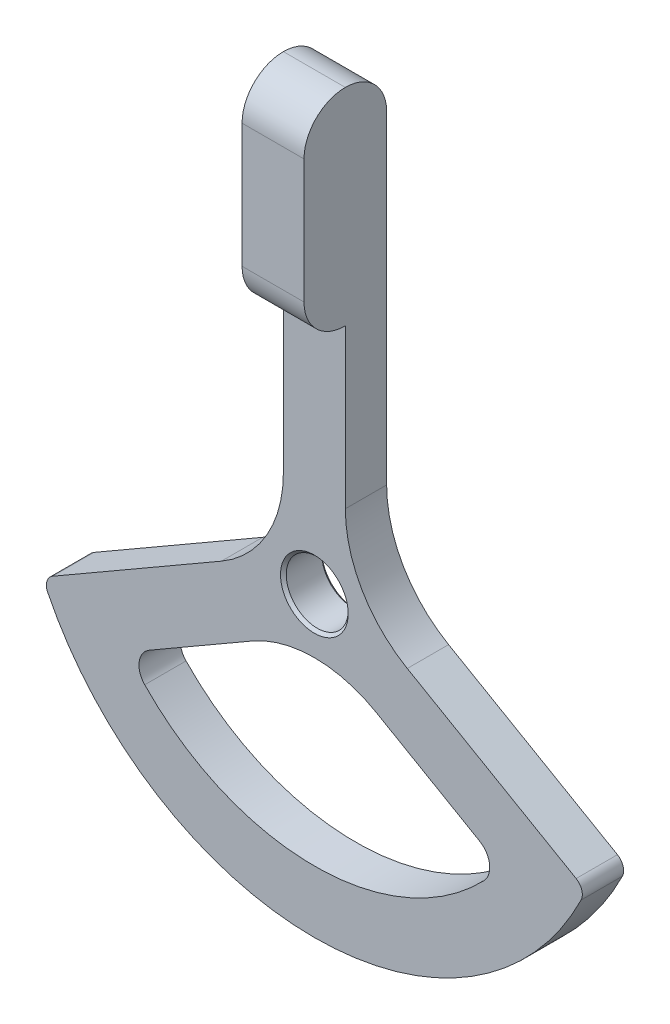
ISO-10303-21;
HEADER;
FILE_DESCRIPTION(('STEP AP214'),'2;1');
FILE_NAME('part.step','',(''),(''),'','','');
FILE_SCHEMA(('AUTOMOTIVE_DESIGN { 1 0 10303 214 1 1 1 1 }'));
ENDSEC;
DATA;
#1=APPLICATION_CONTEXT('core data for automotive mechanical design processes');
#2=APPLICATION_PROTOCOL_DEFINITION('international standard','automotive_design',2000,#1);
#3=PRODUCT_CONTEXT('',#1,'mechanical');
#4=PRODUCT('Part','Part','',(#3));
#5=PRODUCT_RELATED_PRODUCT_CATEGORY('part','',(#4));
#6=PRODUCT_DEFINITION_FORMATION('','',#4);
#7=PRODUCT_DEFINITION_CONTEXT('part definition',#1,'design');
#8=PRODUCT_DEFINITION('design','',#6,#7);
#9=PRODUCT_DEFINITION_SHAPE('','',#8);
#10=(LENGTH_UNIT() NAMED_UNIT(*) SI_UNIT(.MILLI.,.METRE.));
#11=(NAMED_UNIT(*) PLANE_ANGLE_UNIT() SI_UNIT($,.RADIAN.));
#12=(NAMED_UNIT(*) SI_UNIT($,.STERADIAN.) SOLID_ANGLE_UNIT());
#13=UNCERTAINTY_MEASURE_WITH_UNIT(LENGTH_MEASURE(1.E-05),#10,'distance_accuracy_value','');
#14=(GEOMETRIC_REPRESENTATION_CONTEXT(3) GLOBAL_UNCERTAINTY_ASSIGNED_CONTEXT((#13)) GLOBAL_UNIT_ASSIGNED_CONTEXT((#10,
#11,#12)) REPRESENTATION_CONTEXT('',''));
#15=CARTESIAN_POINT('',(0.,0.,0.));
#16=DIRECTION('',(0.,0.,1.));
#17=DIRECTION('',(1.,0.,0.));
#18=AXIS2_PLACEMENT_3D('',#15,#16,#17);
#19=CARTESIAN_POINT('',(0.,0.,5.));
#20=DIRECTION('',(0.,0.,1.));
#21=DIRECTION('',(1.,0.,0.));
#22=AXIS2_PLACEMENT_3D('',#19,#20,#21);
#23=PLANE('',#22);
#24=CARTESIAN_POINT('',(0.,0.,5.));
#25=DIRECTION('',(0.,0.,1.));
#26=DIRECTION('',(1.,0.,0.));
#27=AXIS2_PLACEMENT_3D('',#24,#25,#26);
#28=CIRCLE('',#27,8.20000000000004);
#29=CARTESIAN_POINT('',(8.20000000000004,0.,5.));
#30=VERTEX_POINT('',#29);
#31=EDGE_CURVE('E305',#30,#30,#28,.F.);
#32=ORIENTED_EDGE('',*,*,#31,.T.);
#33=EDGE_LOOP('',(#32));
#34=FACE_BOUND('',#33,.T.);
#35=CARTESIAN_POINT('',(0.,0.,5.));
#36=DIRECTION('',(0.,0.,1.));
#37=DIRECTION('',(1.,0.,0.));
#38=AXIS2_PLACEMENT_3D('',#35,#36,#37);
#39=CIRCLE('',#38,72.);
#40=CARTESIAN_POINT('',(-64.5689088322464,-31.8568048023188,5.));
#41=VERTEX_POINT('',#40);
#42=CARTESIAN_POINT('',(64.5689088322464,-31.8568048023188,5.));
#43=VERTEX_POINT('',#42);
#44=EDGE_CURVE('E216',#41,#43,#39,.T.);
#45=ORIENTED_EDGE('',*,*,#44,.T.);
#46=CARTESIAN_POINT('',(61.8785376309028,-30.5294379355555,5.));
#47=DIRECTION('',(0.,0.,1.));
#48=DIRECTION('',(1.,0.,0.));
#49=AXIS2_PLACEMENT_3D('',#46,#47,#48);
#50=CIRCLE('',#49,3.);
#51=CARTESIAN_POINT('',(63.3785376309028,-27.9313617242022,5.));
#52=VERTEX_POINT('',#51);
#53=EDGE_CURVE('E40',#43,#52,#50,.T.);
#54=ORIENTED_EDGE('',*,*,#53,.T.);
#55=DIRECTION('',(-0.866025403784436,0.500000000000004,0.));
#56=VECTOR('',#55,1.);
#57=CARTESIAN_POINT('',(65.7646152128673,-29.3089642584568,5.));
#58=LINE('',#57,#56);
#59=CARTESIAN_POINT('',(22.4999999999999,-4.33012701892189,5.));
#60=VERTEX_POINT('',#59);
#61=EDGE_CURVE('E187',#52,#60,#58,.T.);
#62=ORIENTED_EDGE('',*,*,#61,.T.);
#63=CARTESIAN_POINT('',(37.5,21.6506350946112,5.));
#64=DIRECTION('',(0.,0.,1.));
#65=DIRECTION('',(1.,0.,0.));
#66=AXIS2_PLACEMENT_3D('',#63,#64,#65);
#67=CIRCLE('',#66,30.);
#68=CARTESIAN_POINT('',(7.49999999999999,21.6506350946112,5.));
#69=VERTEX_POINT('',#68);
#70=EDGE_CURVE('E185',#60,#69,#67,.F.);
#71=ORIENTED_EDGE('',*,*,#70,.T.);
#72=DIRECTION('',(0.,1.,0.));
#73=VECTOR('',#72,1.);
#74=CARTESIAN_POINT('',(7.49999999999999,4.33012701892251,5.));
#75=LINE('',#74,#73);
#76=CARTESIAN_POINT('',(7.49999999999999,60.,4.99999999999999));
#77=VERTEX_POINT('',#76);
#78=EDGE_CURVE('E169',#69,#77,#75,.T.);
#79=ORIENTED_EDGE('',*,*,#78,.T.);
#80=DIRECTION('',(1.,0.,0.));
#81=VECTOR('',#80,1.);
#82=CARTESIAN_POINT('',(-58.4901951359279,60.,4.99999999999999));
#83=LINE('',#82,#81);
#84=CARTESIAN_POINT('',(-7.5,60.,5.));
#85=VERTEX_POINT('',#84);
#86=EDGE_CURVE('E182',#85,#77,#83,.T.);
#87=ORIENTED_EDGE('',*,*,#86,.F.);
#88=DIRECTION('',(0.,-1.,0.));
#89=VECTOR('',#88,1.);
#90=CARTESIAN_POINT('',(-7.49999999999999,4.33012701892221,5.));
#91=LINE('',#90,#89);
#92=CARTESIAN_POINT('',(-7.49999999999999,21.650635094611,5.));
#93=VERTEX_POINT('',#92);
#94=EDGE_CURVE('E186',#85,#93,#91,.T.);
#95=ORIENTED_EDGE('',*,*,#94,.T.);
#96=CARTESIAN_POINT('',(-37.5,21.650635094611,5.));
#97=DIRECTION('',(0.,0.,1.));
#98=DIRECTION('',(1.,0.,0.));
#99=AXIS2_PLACEMENT_3D('',#96,#97,#98);
#100=CIRCLE('',#99,30.);
#101=CARTESIAN_POINT('',(-22.5,-4.33012701892219,5.));
#102=VERTEX_POINT('',#101);
#103=EDGE_CURVE('E256',#93,#102,#100,.F.);
#104=ORIENTED_EDGE('',*,*,#103,.T.);
#105=DIRECTION('',(-0.866025403784438,-0.500000000000001,0.));
#106=VECTOR('',#105,1.);
#107=CARTESIAN_POINT('',(-65.7646152128673,-29.3089642584568,5.));
#108=LINE('',#107,#106);
#109=CARTESIAN_POINT('',(-63.3785376309028,-27.9313617242022,5.));
#110=VERTEX_POINT('',#109);
#111=EDGE_CURVE('E221',#102,#110,#108,.T.);
#112=ORIENTED_EDGE('',*,*,#111,.T.);
#113=CARTESIAN_POINT('',(-61.8785376309028,-30.5294379355556,5.));
#114=DIRECTION('',(0.,0.,1.));
#115=DIRECTION('',(1.,0.,0.));
#116=AXIS2_PLACEMENT_3D('',#113,#114,#115);
#117=CIRCLE('',#116,3.);
#118=EDGE_CURVE('E319',#110,#41,#117,.T.);
#119=ORIENTED_EDGE('',*,*,#118,.T.);
#120=EDGE_LOOP('',(#45,#54,#62,#71,#79,#87,#95,#104,#112,#119));
#121=FACE_BOUND('',#120,.T.);
#122=DIRECTION('',(-0.866025403784436,0.500000000000004,0.));
#123=VECTOR('',#122,1.);
#124=CARTESIAN_POINT('',(45.184267134596,-34.7474028311393,5.));
#125=LINE('',#124,#123);
#126=CARTESIAN_POINT('',(39.9628413626935,-31.7328112561777,5.));
#127=VERTEX_POINT('',#126);
#128=CARTESIAN_POINT('',(15.0000000000003,-17.3205080756887,5.));
#129=VERTEX_POINT('',#128);
#130=EDGE_CURVE('E203',#127,#129,#125,.T.);
#131=ORIENTED_EDGE('',*,*,#130,.F.);
#132=CARTESIAN_POINT('',(37.4628413626935,-36.0629382750999,5.));
#133=DIRECTION('',(0.,0.,1.));
#134=DIRECTION('',(1.,0.,0.));
#135=AXIS2_PLACEMENT_3D('',#132,#133,#134);
#136=CIRCLE('',#135,5.);
#137=CARTESIAN_POINT('',(41.0650376475678,-39.5305284938595,5.));
#138=VERTEX_POINT('',#137);
#139=EDGE_CURVE('E278',#127,#138,#136,.F.);
#140=ORIENTED_EDGE('',*,*,#139,.T.);
#141=CARTESIAN_POINT('',(0.,0.,5.));
#142=DIRECTION('',(0.,0.,1.));
#143=DIRECTION('',(1.,0.,0.));
#144=AXIS2_PLACEMENT_3D('',#141,#142,#143);
#145=CIRCLE('',#144,57.);
#146=CARTESIAN_POINT('',(-41.0650376475678,-39.5305284938596,5.));
#147=VERTEX_POINT('',#146);
#148=EDGE_CURVE('E200',#147,#138,#145,.T.);
#149=ORIENTED_EDGE('',*,*,#148,.F.);
#150=CARTESIAN_POINT('',(-37.4628413626934,-36.0629382751,5.));
#151=DIRECTION('',(0.,0.,1.));
#152=DIRECTION('',(1.,0.,0.));
#153=AXIS2_PLACEMENT_3D('',#150,#151,#152);
#154=CIRCLE('',#153,5.);
#155=CARTESIAN_POINT('',(-39.9628413626934,-31.7328112561778,5.));
#156=VERTEX_POINT('',#155);
#157=EDGE_CURVE('E274',#147,#156,#154,.F.);
#158=ORIENTED_EDGE('',*,*,#157,.T.);
#159=DIRECTION('',(-0.866025403784438,-0.500000000000001,0.));
#160=VECTOR('',#159,1.);
#161=CARTESIAN_POINT('',(-45.184267134596,-34.7474028311393,5.));
#162=LINE('',#161,#160);
#163=CARTESIAN_POINT('',(-14.9999999999998,-17.3205080756887,5.));
#164=VERTEX_POINT('',#163);
#165=EDGE_CURVE('E206',#164,#156,#162,.T.);
#166=ORIENTED_EDGE('',*,*,#165,.F.);
#167=CARTESIAN_POINT('',(2.04697370165263E-13,-43.3012701892218,5.));
#168=DIRECTION('',(0.,0.,1.));
#169=DIRECTION('',(1.,0.,0.));
#170=AXIS2_PLACEMENT_3D('',#167,#168,#169);
#171=CIRCLE('',#170,30.);
#172=EDGE_CURVE('E250',#164,#129,#171,.F.);
#173=ORIENTED_EDGE('',*,*,#172,.T.);
#174=EDGE_LOOP('',(#131,#140,#149,#158,#166,#173));
#175=FACE_BOUND('',#174,.T.);
#176=ADVANCED_FACE('F32',(#34,#121,#175),#23,.T.);
#177=CARTESIAN_POINT('',(0.,0.,-5.));
#178=DIRECTION('',(0.,0.,1.));
#179=DIRECTION('',(1.,0.,0.));
#180=AXIS2_PLACEMENT_3D('',#177,#178,#179);
#181=PLANE('',#180);
#182=CARTESIAN_POINT('',(0.,0.,-5.));
#183=DIRECTION('',(0.,0.,1.));
#184=DIRECTION('',(1.,0.,0.));
#185=AXIS2_PLACEMENT_3D('',#182,#183,#184);
#186=CIRCLE('',#185,8.20000000000001);
#187=CARTESIAN_POINT('',(8.20000000000001,0.,-5.));
#188=VERTEX_POINT('',#187);
#189=EDGE_CURVE('E302',#188,#188,#186,.T.);
#190=ORIENTED_EDGE('',*,*,#189,.T.);
#191=EDGE_LOOP('',(#190));
#192=FACE_BOUND('',#191,.T.);
#193=DIRECTION('',(-0.866025403784436,0.500000000000004,0.));
#194=VECTOR('',#193,1.);
#195=CARTESIAN_POINT('',(65.7646152128673,-29.3089642584568,-5.));
#196=LINE('',#195,#194);
#197=CARTESIAN_POINT('',(63.3785376309028,-27.9313617242022,-5.));
#198=VERTEX_POINT('',#197);
#199=CARTESIAN_POINT('',(22.4999999999999,-4.33012701892189,-5.));
#200=VERTEX_POINT('',#199);
#201=EDGE_CURVE('E225',#198,#200,#196,.T.);
#202=ORIENTED_EDGE('',*,*,#201,.F.);
#203=CARTESIAN_POINT('',(61.8785376309028,-30.5294379355555,-5.));
#204=DIRECTION('',(0.,0.,1.));
#205=DIRECTION('',(1.,0.,0.));
#206=AXIS2_PLACEMENT_3D('',#203,#204,#205);
#207=CIRCLE('',#206,3.);
#208=CARTESIAN_POINT('',(64.5689088322464,-31.8568048023188,-5.));
#209=VERTEX_POINT('',#208);
#210=EDGE_CURVE('E313',#198,#209,#207,.F.);
#211=ORIENTED_EDGE('',*,*,#210,.T.);
#212=CARTESIAN_POINT('',(0.,0.,-5.));
#213=DIRECTION('',(0.,0.,1.));
#214=DIRECTION('',(1.,0.,0.));
#215=AXIS2_PLACEMENT_3D('',#212,#213,#214);
#216=CIRCLE('',#215,72.);
#217=CARTESIAN_POINT('',(-64.5689088322464,-31.8568048023188,-5.));
#218=VERTEX_POINT('',#217);
#219=EDGE_CURVE('E209',#218,#209,#216,.T.);
#220=ORIENTED_EDGE('',*,*,#219,.F.);
#221=CARTESIAN_POINT('',(-61.8785376309028,-30.5294379355556,-5.));
#222=DIRECTION('',(0.,0.,1.));
#223=DIRECTION('',(1.,0.,0.));
#224=AXIS2_PLACEMENT_3D('',#221,#222,#223);
#225=CIRCLE('',#224,3.);
#226=CARTESIAN_POINT('',(-63.3785376309028,-27.9313617242022,-5.));
#227=VERTEX_POINT('',#226);
#228=EDGE_CURVE('E311',#218,#227,#225,.F.);
#229=ORIENTED_EDGE('',*,*,#228,.T.);
#230=DIRECTION('',(-0.866025403784438,-0.500000000000001,0.));
#231=VECTOR('',#230,1.);
#232=CARTESIAN_POINT('',(-65.7646152128673,-29.3089642584568,-5.));
#233=LINE('',#232,#231);
#234=CARTESIAN_POINT('',(-22.5,-4.33012701892219,-5.));
#235=VERTEX_POINT('',#234);
#236=EDGE_CURVE('E218',#235,#227,#233,.T.);
#237=ORIENTED_EDGE('',*,*,#236,.F.);
#238=CARTESIAN_POINT('',(-37.5,21.650635094611,-5.));
#239=DIRECTION('',(0.,0.,1.));
#240=DIRECTION('',(1.,0.,0.));
#241=AXIS2_PLACEMENT_3D('',#238,#239,#240);
#242=CIRCLE('',#241,30.);
#243=CARTESIAN_POINT('',(-7.49999999999999,21.650635094611,-5.));
#244=VERTEX_POINT('',#243);
#245=EDGE_CURVE('E253',#235,#244,#242,.T.);
#246=ORIENTED_EDGE('',*,*,#245,.T.);
#247=DIRECTION('',(0.,-1.,0.));
#248=VECTOR('',#247,1.);
#249=CARTESIAN_POINT('',(-7.49999999999999,4.33012701892221,-5.));
#250=LINE('',#249,#248);
#251=CARTESIAN_POINT('',(-7.5,100.,-5.));
#252=VERTEX_POINT('',#251);
#253=EDGE_CURVE('E230',#252,#244,#250,.T.);
#254=ORIENTED_EDGE('',*,*,#253,.F.);
#255=DIRECTION('',(-1.,0.,0.));
#256=VECTOR('',#255,1.);
#257=CARTESIAN_POINT('',(0.,100.,-5.));
#258=LINE('',#257,#256);
#259=CARTESIAN_POINT('',(7.5,100.,-5.));
#260=VERTEX_POINT('',#259);
#261=EDGE_CURVE('E291',#252,#260,#258,.F.);
#262=ORIENTED_EDGE('',*,*,#261,.T.);
#263=DIRECTION('',(0.,1.,0.));
#264=VECTOR('',#263,1.);
#265=CARTESIAN_POINT('',(7.49999999999999,4.33012701892251,-5.));
#266=LINE('',#265,#264);
#267=CARTESIAN_POINT('',(7.49999999999999,21.6506350946112,-5.));
#268=VERTEX_POINT('',#267);
#269=EDGE_CURVE('E227',#268,#260,#266,.T.);
#270=ORIENTED_EDGE('',*,*,#269,.F.);
#271=CARTESIAN_POINT('',(37.5,21.6506350946112,-5.));
#272=DIRECTION('',(0.,0.,1.));
#273=DIRECTION('',(1.,0.,0.));
#274=AXIS2_PLACEMENT_3D('',#271,#272,#273);
#275=CIRCLE('',#274,30.);
#276=EDGE_CURVE('E258',#268,#200,#275,.T.);
#277=ORIENTED_EDGE('',*,*,#276,.T.);
#278=EDGE_LOOP('',(#202,#211,#220,#229,#237,#246,#254,#262,#270,#277));
#279=FACE_BOUND('',#278,.T.);
#280=DIRECTION('',(-0.866025403784438,-0.500000000000001,0.));
#281=VECTOR('',#280,1.);
#282=CARTESIAN_POINT('',(-45.184267134596,-34.7474028311393,-5.));
#283=LINE('',#282,#281);
#284=CARTESIAN_POINT('',(-14.9999999999998,-17.3205080756887,-5.));
#285=VERTEX_POINT('',#284);
#286=CARTESIAN_POINT('',(-39.9628413626934,-31.7328112561778,-5.));
#287=VERTEX_POINT('',#286);
#288=EDGE_CURVE('E204',#285,#287,#283,.T.);
#289=ORIENTED_EDGE('',*,*,#288,.T.);
#290=CARTESIAN_POINT('',(-37.4628413626934,-36.0629382751,-5.));
#291=DIRECTION('',(0.,0.,1.));
#292=DIRECTION('',(1.,0.,0.));
#293=AXIS2_PLACEMENT_3D('',#290,#291,#292);
#294=CIRCLE('',#293,5.);
#295=CARTESIAN_POINT('',(-41.0650376475678,-39.5305284938596,-5.));
#296=VERTEX_POINT('',#295);
#297=EDGE_CURVE('E272',#287,#296,#294,.T.);
#298=ORIENTED_EDGE('',*,*,#297,.T.);
#299=CARTESIAN_POINT('',(0.,0.,-5.));
#300=DIRECTION('',(0.,0.,1.));
#301=DIRECTION('',(1.,0.,0.));
#302=AXIS2_PLACEMENT_3D('',#299,#300,#301);
#303=CIRCLE('',#302,57.);
#304=CARTESIAN_POINT('',(41.0650376475678,-39.5305284938595,-5.));
#305=VERTEX_POINT('',#304);
#306=EDGE_CURVE('E195',#296,#305,#303,.T.);
#307=ORIENTED_EDGE('',*,*,#306,.T.);
#308=CARTESIAN_POINT('',(37.4628413626935,-36.0629382750999,-5.));
#309=DIRECTION('',(0.,0.,1.));
#310=DIRECTION('',(1.,0.,0.));
#311=AXIS2_PLACEMENT_3D('',#308,#309,#310);
#312=CIRCLE('',#311,5.);
#313=CARTESIAN_POINT('',(39.9628413626935,-31.7328112561777,-5.));
#314=VERTEX_POINT('',#313);
#315=EDGE_CURVE('E276',#305,#314,#312,.T.);
#316=ORIENTED_EDGE('',*,*,#315,.T.);
#317=DIRECTION('',(-0.866025403784436,0.500000000000004,0.));
#318=VECTOR('',#317,1.);
#319=CARTESIAN_POINT('',(45.184267134596,-34.7474028311393,-5.));
#320=LINE('',#319,#318);
#321=CARTESIAN_POINT('',(15.0000000000003,-17.3205080756887,-5.));
#322=VERTEX_POINT('',#321);
#323=EDGE_CURVE('E212',#314,#322,#320,.T.);
#324=ORIENTED_EDGE('',*,*,#323,.T.);
#325=CARTESIAN_POINT('',(2.04697370165263E-13,-43.3012701892218,-5.));
#326=DIRECTION('',(0.,0.,1.));
#327=DIRECTION('',(1.,0.,0.));
#328=AXIS2_PLACEMENT_3D('',#325,#326,#327);
#329=CIRCLE('',#328,30.);
#330=EDGE_CURVE('E248',#322,#285,#329,.T.);
#331=ORIENTED_EDGE('',*,*,#330,.T.);
#332=EDGE_LOOP('',(#289,#298,#307,#316,#324,#331));
#333=FACE_BOUND('',#332,.T.);
#334=ADVANCED_FACE('F331',(#192,#279,#333),#181,.F.);
#335=CARTESIAN_POINT('',(0.,0.,5.));
#336=DIRECTION('',(0.,0.,-1.));
#337=DIRECTION('',(-1.,0.,0.));
#338=AXIS2_PLACEMENT_3D('',#335,#336,#337);
#339=CYLINDRICAL_SURFACE('',#338,72.);
#340=ORIENTED_EDGE('',*,*,#219,.T.);
#341=DIRECTION('',(0.,0.,-1.));
#342=VECTOR('',#341,1.);
#343=CARTESIAN_POINT('',(64.5689088322464,-31.8568048023188,5.));
#344=LINE('',#343,#342);
#345=EDGE_CURVE('E53',#209,#43,#344,.F.);
#346=ORIENTED_EDGE('',*,*,#345,.T.);
#347=ORIENTED_EDGE('',*,*,#44,.F.);
#348=DIRECTION('',(0.,0.,-1.));
#349=VECTOR('',#348,1.);
#350=CARTESIAN_POINT('',(-64.5689088322464,-31.8568048023188,5.));
#351=LINE('',#350,#349);
#352=EDGE_CURVE('E315',#41,#218,#351,.T.);
#353=ORIENTED_EDGE('',*,*,#352,.T.);
#354=EDGE_LOOP('',(#340,#346,#347,#353));
#355=FACE_BOUND('',#354,.T.);
#356=ADVANCED_FACE('F333',(#355),#339,.T.);
#357=CARTESIAN_POINT('',(65.7646152128673,-29.3089642584568,5.));
#358=DIRECTION('',(-0.500000000000004,-0.866025403784436,0.));
#359=DIRECTION('',(0.866025403784436,-0.500000000000004,0.));
#360=AXIS2_PLACEMENT_3D('',#357,#358,#359);
#361=PLANE('',#360);
#362=ORIENTED_EDGE('',*,*,#61,.F.);
#363=DIRECTION('',(0.,0.,-1.));
#364=VECTOR('',#363,1.);
#365=CARTESIAN_POINT('',(63.3785376309028,-27.9313617242022,5.));
#366=LINE('',#365,#364);
#367=EDGE_CURVE('E308',#52,#198,#366,.T.);
#368=ORIENTED_EDGE('',*,*,#367,.T.);
#369=ORIENTED_EDGE('',*,*,#201,.T.);
#370=DIRECTION('',(0.,0.,-1.));
#371=VECTOR('',#370,1.);
#372=CARTESIAN_POINT('',(22.4999999999999,-4.3301270189219,5.));
#373=LINE('',#372,#371);
#374=EDGE_CURVE('E245',#200,#60,#373,.F.);
#375=ORIENTED_EDGE('',*,*,#374,.T.);
#376=EDGE_LOOP('',(#362,#368,#369,#375));
#377=FACE_BOUND('',#376,.T.);
#378=ADVANCED_FACE('F325',(#377),#361,.F.);
#379=CARTESIAN_POINT('',(7.49999999999999,4.33012701892251,5.));
#380=DIRECTION('',(-1.,0.,0.));
#381=DIRECTION('',(0.,-1.,0.));
#382=AXIS2_PLACEMENT_3D('',#379,#380,#381);
#383=PLANE('',#382);
#384=DIRECTION('',(0.,-1.,0.));
#385=VECTOR('',#384,1.);
#386=CARTESIAN_POINT('',(7.49999999999999,110.,15.));
#387=LINE('',#386,#385);
#388=CARTESIAN_POINT('',(7.49999999999999,100.,15.));
#389=VERTEX_POINT('',#388);
#390=CARTESIAN_POINT('',(7.49999999999999,70.,15.));
#391=VERTEX_POINT('',#390);
#392=EDGE_CURVE('E172',#389,#391,#387,.T.);
#393=ORIENTED_EDGE('',*,*,#392,.T.);
#394=CARTESIAN_POINT('',(7.49999999999999,70.,4.99999999999999));
#395=DIRECTION('',(-1.,0.,0.));
#396=DIRECTION('',(0.,-1.,0.));
#397=AXIS2_PLACEMENT_3D('',#394,#395,#396);
#398=CIRCLE('',#397,10.);
#399=EDGE_CURVE('E165',#391,#77,#398,.F.);
#400=ORIENTED_EDGE('',*,*,#399,.T.);
#401=ORIENTED_EDGE('',*,*,#78,.F.);
#402=DIRECTION('',(0.,0.,-1.));
#403=VECTOR('',#402,1.);
#404=CARTESIAN_POINT('',(7.49999999999999,21.6506350946112,-5.));
#405=LINE('',#404,#403);
#406=EDGE_CURVE('E243',#69,#268,#405,.T.);
#407=ORIENTED_EDGE('',*,*,#406,.T.);
#408=ORIENTED_EDGE('',*,*,#269,.T.);
#409=CARTESIAN_POINT('',(7.5,100.,5.));
#410=DIRECTION('',(-1.,0.,0.));
#411=DIRECTION('',(0.,-1.,0.));
#412=AXIS2_PLACEMENT_3D('',#409,#410,#411);
#413=CIRCLE('',#412,10.);
#414=CARTESIAN_POINT('',(7.5,110.,5.));
#415=VERTEX_POINT('',#414);
#416=EDGE_CURVE('E178',#260,#415,#413,.F.);
#417=ORIENTED_EDGE('',*,*,#416,.T.);
#418=CARTESIAN_POINT('',(7.5,100.,5.));
#419=DIRECTION('',(-1.,0.,0.));
#420=DIRECTION('',(0.,-1.,0.));
#421=AXIS2_PLACEMENT_3D('',#418,#419,#420);
#422=CIRCLE('',#421,10.);
#423=EDGE_CURVE('E284',#415,#389,#422,.F.);
#424=ORIENTED_EDGE('',*,*,#423,.T.);
#425=EDGE_LOOP('',(#393,#400,#401,#407,#408,#417,#424));
#426=FACE_BOUND('',#425,.T.);
#427=ADVANCED_FACE('F167',(#426),#383,.F.);
#428=CARTESIAN_POINT('',(-7.49999999999999,4.33012701892221,5.));
#429=DIRECTION('',(1.,0.,0.));
#430=DIRECTION('',(0.,1.,0.));
#431=AXIS2_PLACEMENT_3D('',#428,#429,#430);
#432=PLANE('',#431);
#433=ORIENTED_EDGE('',*,*,#94,.F.);
#434=CARTESIAN_POINT('',(-7.5,70.,4.99999999999999));
#435=DIRECTION('',(1.,0.,0.));
#436=DIRECTION('',(0.,1.,0.));
#437=AXIS2_PLACEMENT_3D('',#434,#435,#436);
#438=CIRCLE('',#437,10.);
#439=CARTESIAN_POINT('',(-7.5,70.,15.));
#440=VERTEX_POINT('',#439);
#441=EDGE_CURVE('E191',#85,#440,#438,.F.);
#442=ORIENTED_EDGE('',*,*,#441,.T.);
#443=DIRECTION('',(0.,1.,0.));
#444=VECTOR('',#443,1.);
#445=CARTESIAN_POINT('',(-7.5,110.,15.));
#446=LINE('',#445,#444);
#447=CARTESIAN_POINT('',(-7.5,100.,15.));
#448=VERTEX_POINT('',#447);
#449=EDGE_CURVE('E192',#440,#448,#446,.T.);
#450=ORIENTED_EDGE('',*,*,#449,.T.);
#451=CARTESIAN_POINT('',(-7.5,100.,5.));
#452=DIRECTION('',(1.,0.,0.));
#453=DIRECTION('',(0.,1.,0.));
#454=AXIS2_PLACEMENT_3D('',#451,#452,#453);
#455=CIRCLE('',#454,10.);
#456=CARTESIAN_POINT('',(-7.5,110.,5.));
#457=VERTEX_POINT('',#456);
#458=EDGE_CURVE('E177',#448,#457,#455,.F.);
#459=ORIENTED_EDGE('',*,*,#458,.T.);
#460=CARTESIAN_POINT('',(-7.5,100.,5.));
#461=DIRECTION('',(1.,0.,0.));
#462=DIRECTION('',(0.,1.,0.));
#463=AXIS2_PLACEMENT_3D('',#460,#461,#462);
#464=CIRCLE('',#463,10.);
#465=EDGE_CURVE('E288',#457,#252,#464,.F.);
#466=ORIENTED_EDGE('',*,*,#465,.T.);
#467=ORIENTED_EDGE('',*,*,#253,.T.);
#468=DIRECTION('',(0.,0.,-1.));
#469=VECTOR('',#468,1.);
#470=CARTESIAN_POINT('',(-7.49999999999999,21.650635094611,5.));
#471=LINE('',#470,#469);
#472=EDGE_CURVE('E240',#244,#93,#471,.F.);
#473=ORIENTED_EDGE('',*,*,#472,.T.);
#474=EDGE_LOOP('',(#433,#442,#450,#459,#466,#467,#473));
#475=FACE_BOUND('',#474,.T.);
#476=ADVANCED_FACE('F360',(#475),#432,.F.);
#477=CARTESIAN_POINT('',(-65.7646152128673,-29.3089642584568,5.));
#478=DIRECTION('',(0.500000000000001,-0.866025403784438,0.));
#479=DIRECTION('',(0.866025403784438,0.500000000000001,0.));
#480=AXIS2_PLACEMENT_3D('',#477,#478,#479);
#481=PLANE('',#480);
#482=ORIENTED_EDGE('',*,*,#236,.T.);
#483=DIRECTION('',(0.,0.,-1.));
#484=VECTOR('',#483,1.);
#485=CARTESIAN_POINT('',(-63.3785376309028,-27.9313617242022,5.));
#486=LINE('',#485,#484);
#487=EDGE_CURVE('E11',#227,#110,#486,.F.);
#488=ORIENTED_EDGE('',*,*,#487,.T.);
#489=ORIENTED_EDGE('',*,*,#111,.F.);
#490=DIRECTION('',(0.,0.,-1.));
#491=VECTOR('',#490,1.);
#492=CARTESIAN_POINT('',(-22.5,-4.33012701892219,-5.));
#493=LINE('',#492,#491);
#494=EDGE_CURVE('E237',#102,#235,#493,.T.);
#495=ORIENTED_EDGE('',*,*,#494,.T.);
#496=EDGE_LOOP('',(#482,#488,#489,#495));
#497=FACE_BOUND('',#496,.T.);
#498=ADVANCED_FACE('F338',(#497),#481,.F.);
#499=CARTESIAN_POINT('',(0.,0.,5.));
#500=DIRECTION('',(0.,0.,-1.));
#501=DIRECTION('',(-1.,0.,0.));
#502=AXIS2_PLACEMENT_3D('',#499,#500,#501);
#503=CYLINDRICAL_SURFACE('',#502,57.);
#504=ORIENTED_EDGE('',*,*,#306,.F.);
#505=DIRECTION('',(0.,0.,-1.));
#506=VECTOR('',#505,1.);
#507=CARTESIAN_POINT('',(-41.0650376475678,-39.5305284938596,5.));
#508=LINE('',#507,#506);
#509=EDGE_CURVE('E268',#296,#147,#508,.F.);
#510=ORIENTED_EDGE('',*,*,#509,.T.);
#511=ORIENTED_EDGE('',*,*,#148,.T.);
#512=DIRECTION('',(0.,0.,-1.));
#513=VECTOR('',#512,1.);
#514=CARTESIAN_POINT('',(41.0650376475678,-39.5305284938595,5.));
#515=LINE('',#514,#513);
#516=EDGE_CURVE('E265',#138,#305,#515,.T.);
#517=ORIENTED_EDGE('',*,*,#516,.T.);
#518=EDGE_LOOP('',(#504,#510,#511,#517));
#519=FACE_BOUND('',#518,.T.);
#520=ADVANCED_FACE('F367',(#519),#503,.F.);
#521=CARTESIAN_POINT('',(45.184267134596,-34.7474028311393,5.));
#522=DIRECTION('',(-0.500000000000004,-0.866025403784436,0.));
#523=DIRECTION('',(0.866025403784436,-0.500000000000004,0.));
#524=AXIS2_PLACEMENT_3D('',#521,#522,#523);
#525=PLANE('',#524);
#526=ORIENTED_EDGE('',*,*,#323,.F.);
#527=DIRECTION('',(0.,0.,1.));
#528=VECTOR('',#527,1.);
#529=CARTESIAN_POINT('',(39.9628413626935,-31.7328112561777,5.));
#530=LINE('',#529,#528);
#531=EDGE_CURVE('E270',#314,#127,#530,.T.);
#532=ORIENTED_EDGE('',*,*,#531,.T.);
#533=ORIENTED_EDGE('',*,*,#130,.T.);
#534=DIRECTION('',(0.,0.,-1.));
#535=VECTOR('',#534,1.);
#536=CARTESIAN_POINT('',(15.0000000000003,-17.3205080756887,-5.));
#537=LINE('',#536,#535);
#538=EDGE_CURVE('E223',#129,#322,#537,.T.);
#539=ORIENTED_EDGE('',*,*,#538,.T.);
#540=EDGE_LOOP('',(#526,#532,#533,#539));
#541=FACE_BOUND('',#540,.T.);
#542=ADVANCED_FACE('F381',(#541),#525,.T.);
#543=CARTESIAN_POINT('',(-45.184267134596,-34.7474028311393,5.));
#544=DIRECTION('',(0.500000000000001,-0.866025403784438,0.));
#545=DIRECTION('',(0.866025403784438,0.500000000000001,0.));
#546=AXIS2_PLACEMENT_3D('',#543,#544,#545);
#547=PLANE('',#546);
#548=ORIENTED_EDGE('',*,*,#165,.T.);
#549=DIRECTION('',(0.,0.,1.));
#550=VECTOR('',#549,1.);
#551=CARTESIAN_POINT('',(-39.9628413626934,-31.7328112561778,-5.));
#552=LINE('',#551,#550);
#553=EDGE_CURVE('E262',#156,#287,#552,.F.);
#554=ORIENTED_EDGE('',*,*,#553,.T.);
#555=ORIENTED_EDGE('',*,*,#288,.F.);
#556=DIRECTION('',(0.,0.,-1.));
#557=VECTOR('',#556,1.);
#558=CARTESIAN_POINT('',(-14.9999999999998,-17.3205080756887,5.));
#559=LINE('',#558,#557);
#560=EDGE_CURVE('E235',#285,#164,#559,.F.);
#561=ORIENTED_EDGE('',*,*,#560,.T.);
#562=EDGE_LOOP('',(#548,#554,#555,#561));
#563=FACE_BOUND('',#562,.T.);
#564=ADVANCED_FACE('F385',(#563),#547,.T.);
#565=CARTESIAN_POINT('',(2.04697370165263E-13,-43.3012701892218,5.));
#566=DIRECTION('',(0.,0.,1.));
#567=DIRECTION('',(1.,0.,0.));
#568=AXIS2_PLACEMENT_3D('',#565,#566,#567);
#569=CYLINDRICAL_SURFACE('',#568,30.);
#570=ORIENTED_EDGE('',*,*,#172,.F.);
#571=ORIENTED_EDGE('',*,*,#560,.F.);
#572=ORIENTED_EDGE('',*,*,#330,.F.);
#573=ORIENTED_EDGE('',*,*,#538,.F.);
#574=EDGE_LOOP('',(#570,#571,#572,#573));
#575=FACE_BOUND('',#574,.T.);
#576=ADVANCED_FACE('F389',(#575),#569,.F.);
#577=CARTESIAN_POINT('',(-37.5,21.650635094611,5.));
#578=DIRECTION('',(0.,0.,1.));
#579=DIRECTION('',(1.,0.,0.));
#580=AXIS2_PLACEMENT_3D('',#577,#578,#579);
#581=CYLINDRICAL_SURFACE('',#580,30.);
#582=ORIENTED_EDGE('',*,*,#103,.F.);
#583=ORIENTED_EDGE('',*,*,#472,.F.);
#584=ORIENTED_EDGE('',*,*,#245,.F.);
#585=ORIENTED_EDGE('',*,*,#494,.F.);
#586=EDGE_LOOP('',(#582,#583,#584,#585));
#587=FACE_BOUND('',#586,.T.);
#588=ADVANCED_FACE('F342',(#587),#581,.F.);
#589=CARTESIAN_POINT('',(37.5,21.6506350946112,5.));
#590=DIRECTION('',(0.,0.,1.));
#591=DIRECTION('',(1.,0.,0.));
#592=AXIS2_PLACEMENT_3D('',#589,#590,#591);
#593=CYLINDRICAL_SURFACE('',#592,30.);
#594=ORIENTED_EDGE('',*,*,#70,.F.);
#595=ORIENTED_EDGE('',*,*,#374,.F.);
#596=ORIENTED_EDGE('',*,*,#276,.F.);
#597=ORIENTED_EDGE('',*,*,#406,.F.);
#598=EDGE_LOOP('',(#594,#595,#596,#597));
#599=FACE_BOUND('',#598,.T.);
#600=ADVANCED_FACE('F428',(#599),#593,.F.);
#601=CARTESIAN_POINT('',(-37.4628413626934,-36.0629382751,5.));
#602=DIRECTION('',(0.,0.,-1.));
#603=DIRECTION('',(-1.,0.,0.));
#604=AXIS2_PLACEMENT_3D('',#601,#602,#603);
#605=CYLINDRICAL_SURFACE('',#604,5.);
#606=ORIENTED_EDGE('',*,*,#157,.F.);
#607=ORIENTED_EDGE('',*,*,#509,.F.);
#608=ORIENTED_EDGE('',*,*,#297,.F.);
#609=ORIENTED_EDGE('',*,*,#553,.F.);
#610=EDGE_LOOP('',(#606,#607,#608,#609));
#611=FACE_BOUND('',#610,.T.);
#612=ADVANCED_FACE('F424',(#611),#605,.F.);
#613=CARTESIAN_POINT('',(37.4628413626935,-36.0629382750999,5.));
#614=DIRECTION('',(0.,0.,-1.));
#615=DIRECTION('',(-1.,0.,0.));
#616=AXIS2_PLACEMENT_3D('',#613,#614,#615);
#617=CYLINDRICAL_SURFACE('',#616,5.);
#618=ORIENTED_EDGE('',*,*,#139,.F.);
#619=ORIENTED_EDGE('',*,*,#531,.F.);
#620=ORIENTED_EDGE('',*,*,#315,.F.);
#621=ORIENTED_EDGE('',*,*,#516,.F.);
#622=EDGE_LOOP('',(#618,#619,#620,#621));
#623=FACE_BOUND('',#622,.T.);
#624=ADVANCED_FACE('F393',(#623),#617,.F.);
#625=CARTESIAN_POINT('',(-58.4901951359279,110.,15.));
#626=DIRECTION('',(0.,0.,1.));
#627=DIRECTION('',(0.,-1.,0.));
#628=AXIS2_PLACEMENT_3D('',#625,#626,#627);
#629=PLANE('',#628);
#630=ORIENTED_EDGE('',*,*,#449,.F.);
#631=DIRECTION('',(1.,0.,0.));
#632=VECTOR('',#631,1.);
#633=CARTESIAN_POINT('',(-58.4901951359279,70.,15.));
#634=LINE('',#633,#632);
#635=EDGE_CURVE('E282',#440,#391,#634,.T.);
#636=ORIENTED_EDGE('',*,*,#635,.T.);
#637=ORIENTED_EDGE('',*,*,#392,.F.);
#638=DIRECTION('',(1.,0.,0.));
#639=VECTOR('',#638,1.);
#640=CARTESIAN_POINT('',(-7.5,100.,15.));
#641=LINE('',#640,#639);
#642=EDGE_CURVE('E280',#389,#448,#641,.F.);
#643=ORIENTED_EDGE('',*,*,#642,.T.);
#644=EDGE_LOOP('',(#630,#636,#637,#643));
#645=FACE_BOUND('',#644,.T.);
#646=ADVANCED_FACE('F359',(#645),#629,.T.);
#647=CARTESIAN_POINT('',(-58.4901951359279,70.,4.99999999999999));
#648=DIRECTION('',(1.,0.,0.));
#649=DIRECTION('',(0.,1.,0.));
#650=AXIS2_PLACEMENT_3D('',#647,#648,#649);
#651=CYLINDRICAL_SURFACE('',#650,10.);
#652=ORIENTED_EDGE('',*,*,#441,.F.);
#653=ORIENTED_EDGE('',*,*,#86,.T.);
#654=ORIENTED_EDGE('',*,*,#399,.F.);
#655=ORIENTED_EDGE('',*,*,#635,.F.);
#656=EDGE_LOOP('',(#652,#653,#654,#655));
#657=FACE_BOUND('',#656,.T.);
#658=ADVANCED_FACE('F190',(#657),#651,.T.);
#659=CARTESIAN_POINT('',(0.,100.,5.));
#660=DIRECTION('',(-1.,0.,0.));
#661=DIRECTION('',(0.,0.,1.));
#662=AXIS2_PLACEMENT_3D('',#659,#660,#661);
#663=CYLINDRICAL_SURFACE('',#662,10.);
#664=ORIENTED_EDGE('',*,*,#642,.F.);
#665=ORIENTED_EDGE('',*,*,#423,.F.);
#666=DIRECTION('',(1.,0.,0.));
#667=VECTOR('',#666,1.);
#668=CARTESIAN_POINT('',(7.49999999999999,110.,5.));
#669=LINE('',#668,#667);
#670=EDGE_CURVE('E197',#457,#415,#669,.T.);
#671=ORIENTED_EDGE('',*,*,#670,.F.);
#672=ORIENTED_EDGE('',*,*,#458,.F.);
#673=EDGE_LOOP('',(#664,#665,#671,#672));
#674=FACE_BOUND('',#673,.T.);
#675=ADVANCED_FACE('F355',(#674),#663,.T.);
#676=CARTESIAN_POINT('',(0.,100.,5.));
#677=DIRECTION('',(-1.,0.,0.));
#678=DIRECTION('',(0.,0.,1.));
#679=AXIS2_PLACEMENT_3D('',#676,#677,#678);
#680=CYLINDRICAL_SURFACE('',#679,10.);
#681=ORIENTED_EDGE('',*,*,#416,.F.);
#682=ORIENTED_EDGE('',*,*,#261,.F.);
#683=ORIENTED_EDGE('',*,*,#465,.F.);
#684=ORIENTED_EDGE('',*,*,#670,.T.);
#685=EDGE_LOOP('',(#681,#682,#683,#684));
#686=FACE_BOUND('',#685,.T.);
#687=ADVANCED_FACE('F350',(#686),#680,.T.);
#688=CARTESIAN_POINT('',(0.,0.,-5.001));
#689=DIRECTION('',(0.,0.,1.));
#690=DIRECTION('',(1.,0.,0.));
#691=AXIS2_PLACEMENT_3D('',#688,#689,#690);
#692=CYLINDRICAL_SURFACE('',#691,7.5);
#693=CARTESIAN_POINT('',(0.,0.,-4.29999999999998));
#694=DIRECTION('',(0.,0.,1.));
#695=DIRECTION('',(1.,0.,0.));
#696=AXIS2_PLACEMENT_3D('',#693,#694,#695);
#697=CIRCLE('',#696,7.5);
#698=CARTESIAN_POINT('',(7.5,0.,-4.29999999999998));
#699=VERTEX_POINT('',#698);
#700=EDGE_CURVE('E299',#699,#699,#697,.F.);
#701=ORIENTED_EDGE('',*,*,#700,.T.);
#702=EDGE_LOOP('',(#701));
#703=FACE_BOUND('',#702,.T.);
#704=CARTESIAN_POINT('',(0.,0.,4.29999999999998));
#705=DIRECTION('',(0.,0.,1.));
#706=DIRECTION('',(1.,0.,0.));
#707=AXIS2_PLACEMENT_3D('',#704,#705,#706);
#708=CIRCLE('',#707,7.5);
#709=CARTESIAN_POINT('',(7.5,0.,4.29999999999998));
#710=VERTEX_POINT('',#709);
#711=EDGE_CURVE('E294',#710,#710,#708,.T.);
#712=ORIENTED_EDGE('',*,*,#711,.T.);
#713=EDGE_LOOP('',(#712));
#714=FACE_BOUND('',#713,.T.);
#715=ADVANCED_FACE('F394',(#703,#714),#692,.F.);
#716=CARTESIAN_POINT('',(0.,0.,-4.29999999999998));
#717=DIRECTION('',(0.,0.,-1.));
#718=DIRECTION('',(-1.,0.,0.));
#719=AXIS2_PLACEMENT_3D('',#716,#717,#718);
#720=CONICAL_SURFACE('',#719,7.5,0.785398163397446);
#721=ORIENTED_EDGE('',*,*,#189,.F.);
#722=EDGE_LOOP('',(#721));
#723=FACE_BOUND('',#722,.T.);
#724=ORIENTED_EDGE('',*,*,#700,.F.);
#725=EDGE_LOOP('',(#724));
#726=FACE_BOUND('',#725,.T.);
#727=ADVANCED_FACE('F396',(#723,#726),#720,.F.);
#728=CARTESIAN_POINT('',(0.,0.,4.29999999999998));
#729=DIRECTION('',(0.,0.,1.));
#730=DIRECTION('',(1.,0.,0.));
#731=AXIS2_PLACEMENT_3D('',#728,#729,#730);
#732=CONICAL_SURFACE('',#731,7.5,0.785398163397466);
#733=ORIENTED_EDGE('',*,*,#31,.F.);
#734=EDGE_LOOP('',(#733));
#735=FACE_BOUND('',#734,.T.);
#736=ORIENTED_EDGE('',*,*,#711,.F.);
#737=EDGE_LOOP('',(#736));
#738=FACE_BOUND('',#737,.T.);
#739=ADVANCED_FACE('F402',(#735,#738),#732,.F.);
#740=CARTESIAN_POINT('',(61.8785376309028,-30.5294379355555,5.));
#741=DIRECTION('',(0.,0.,-1.));
#742=DIRECTION('',(-1.,0.,0.));
#743=AXIS2_PLACEMENT_3D('',#740,#741,#742);
#744=CYLINDRICAL_SURFACE('',#743,3.);
#745=ORIENTED_EDGE('',*,*,#53,.F.);
#746=ORIENTED_EDGE('',*,*,#345,.F.);
#747=ORIENTED_EDGE('',*,*,#210,.F.);
#748=ORIENTED_EDGE('',*,*,#367,.F.);
#749=EDGE_LOOP('',(#745,#746,#747,#748));
#750=FACE_BOUND('',#749,.T.);
#751=ADVANCED_FACE('F328',(#750),#744,.T.);
#752=CARTESIAN_POINT('',(-61.8785376309028,-30.5294379355556,5.));
#753=DIRECTION('',(0.,0.,-1.));
#754=DIRECTION('',(-1.,0.,0.));
#755=AXIS2_PLACEMENT_3D('',#752,#753,#754);
#756=CYLINDRICAL_SURFACE('',#755,3.);
#757=ORIENTED_EDGE('',*,*,#118,.F.);
#758=ORIENTED_EDGE('',*,*,#487,.F.);
#759=ORIENTED_EDGE('',*,*,#228,.F.);
#760=ORIENTED_EDGE('',*,*,#352,.F.);
#761=EDGE_LOOP('',(#757,#758,#759,#760));
#762=FACE_BOUND('',#761,.T.);
#763=ADVANCED_FACE('F34',(#762),#756,.T.);
#764=CLOSED_SHELL('',(#176,#334,#356,#378,#427,#476,#498,#520,#542,#564,#576,#588,#600,#612,
#624,#646,#658,#675,#687,#715,#727,#739,#751,#763));
#765=MANIFOLD_SOLID_BREP('B2',#764);
#766=ADVANCED_BREP_SHAPE_REPRESENTATION('',(#18,#765),#14);
#767=SHAPE_DEFINITION_REPRESENTATION(#9,#766);
ENDSEC;
END-ISO-10303-21;
